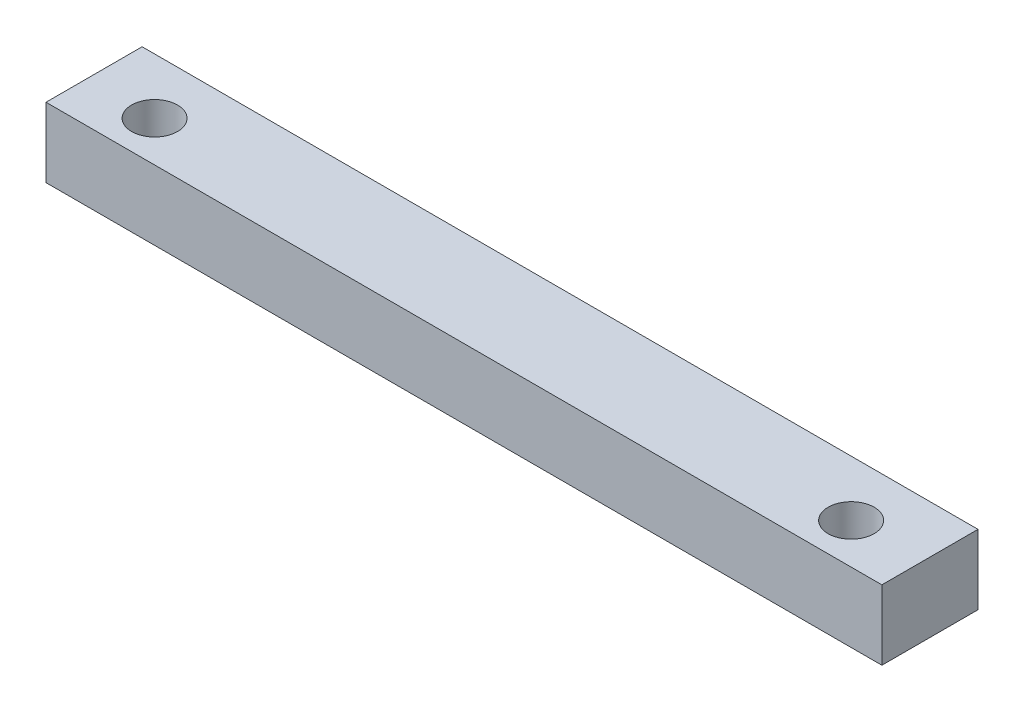
ISO-10303-21;
HEADER;
FILE_DESCRIPTION(('STEP AP214'),'2;1');
FILE_NAME('part.step','',(''),(''),'','','');
FILE_SCHEMA(('AUTOMOTIVE_DESIGN { 1 0 10303 214 1 1 1 1 }'));
ENDSEC;
DATA;
#1=APPLICATION_CONTEXT('core data for automotive mechanical design processes');
#2=APPLICATION_PROTOCOL_DEFINITION('international standard','automotive_design',2000,#1);
#3=PRODUCT_CONTEXT('',#1,'mechanical');
#4=PRODUCT('Part','Part','',(#3));
#5=PRODUCT_RELATED_PRODUCT_CATEGORY('part','',(#4));
#6=PRODUCT_DEFINITION_FORMATION('','',#4);
#7=PRODUCT_DEFINITION_CONTEXT('part definition',#1,'design');
#8=PRODUCT_DEFINITION('design','',#6,#7);
#9=PRODUCT_DEFINITION_SHAPE('','',#8);
#10=(LENGTH_UNIT() NAMED_UNIT(*) SI_UNIT(.MILLI.,.METRE.));
#11=(NAMED_UNIT(*) PLANE_ANGLE_UNIT() SI_UNIT($,.RADIAN.));
#12=(NAMED_UNIT(*) SI_UNIT($,.STERADIAN.) SOLID_ANGLE_UNIT());
#13=UNCERTAINTY_MEASURE_WITH_UNIT(LENGTH_MEASURE(1.E-05),#10,'distance_accuracy_value','');
#14=(GEOMETRIC_REPRESENTATION_CONTEXT(3) GLOBAL_UNCERTAINTY_ASSIGNED_CONTEXT((#13)) GLOBAL_UNIT_ASSIGNED_CONTEXT((#10,
#11,#12)) REPRESENTATION_CONTEXT('',''));
#15=CARTESIAN_POINT('',(0.,0.,0.));
#16=DIRECTION('',(0.,0.,1.));
#17=DIRECTION('',(1.,0.,0.));
#18=AXIS2_PLACEMENT_3D('',#15,#16,#17);
#19=CARTESIAN_POINT('',(-42.9708845876065,5.,-4.52794899372876));
#20=DIRECTION('',(1.,0.,0.));
#21=DIRECTION('',(0.,0.,-1.));
#22=AXIS2_PLACEMENT_3D('',#19,#20,#21);
#23=PLANE('',#22);
#24=DIRECTION('',(0.,0.,1.));
#25=VECTOR('',#24,1.);
#26=CARTESIAN_POINT('',(-42.9708845876065,0.,-4.52794899372876));
#27=LINE('',#26,#25);
#28=CARTESIAN_POINT('',(-42.9708845876065,0.,-4.52794899372876));
#29=VERTEX_POINT('',#28);
#30=CARTESIAN_POINT('',(-42.9708845876065,0.,2.37205100627124));
#31=VERTEX_POINT('',#30);
#32=EDGE_CURVE('E111',#29,#31,#27,.T.);
#33=ORIENTED_EDGE('',*,*,#32,.T.);
#34=DIRECTION('',(0.,-1.,0.));
#35=VECTOR('',#34,1.);
#36=CARTESIAN_POINT('',(-42.9708845876065,5.,2.37205100627124));
#37=LINE('',#36,#35);
#38=CARTESIAN_POINT('',(-42.9708845876065,5.,2.37205100627124));
#39=VERTEX_POINT('',#38);
#40=EDGE_CURVE('E11',#39,#31,#37,.T.);
#41=ORIENTED_EDGE('',*,*,#40,.F.);
#42=DIRECTION('',(0.,0.,1.));
#43=VECTOR('',#42,1.);
#44=CARTESIAN_POINT('',(-42.9708845876065,5.,-4.52794899372876));
#45=LINE('',#44,#43);
#46=CARTESIAN_POINT('',(-42.9708845876065,5.,-4.52794899372876));
#47=VERTEX_POINT('',#46);
#48=EDGE_CURVE('E95',#47,#39,#45,.T.);
#49=ORIENTED_EDGE('',*,*,#48,.F.);
#50=DIRECTION('',(0.,-1.,0.));
#51=VECTOR('',#50,1.);
#52=CARTESIAN_POINT('',(-42.9708845876065,5.,-4.52794899372876));
#53=LINE('',#52,#51);
#54=EDGE_CURVE('E107',#47,#29,#53,.T.);
#55=ORIENTED_EDGE('',*,*,#54,.T.);
#56=EDGE_LOOP('',(#33,#41,#49,#55));
#57=FACE_BOUND('',#56,.T.);
#58=ADVANCED_FACE('F43',(#57),#23,.F.);
#59=CARTESIAN_POINT('',(-42.9708845876065,5.,2.37205100627124));
#60=DIRECTION('',(0.,0.,-1.));
#61=DIRECTION('',(-1.,0.,0.));
#62=AXIS2_PLACEMENT_3D('',#59,#60,#61);
#63=PLANE('',#62);
#64=DIRECTION('',(1.,0.,0.));
#65=VECTOR('',#64,1.);
#66=CARTESIAN_POINT('',(-42.9708845876065,0.,2.37205100627124));
#67=LINE('',#66,#65);
#68=CARTESIAN_POINT('',(17.0291154123935,0.,2.37205100627124));
#69=VERTEX_POINT('',#68);
#70=EDGE_CURVE('E100',#31,#69,#67,.T.);
#71=ORIENTED_EDGE('',*,*,#70,.T.);
#72=DIRECTION('',(0.,-1.,0.));
#73=VECTOR('',#72,1.);
#74=CARTESIAN_POINT('',(17.0291154123935,5.,2.37205100627124));
#75=LINE('',#74,#73);
#76=CARTESIAN_POINT('',(17.0291154123935,5.,2.37205100627124));
#77=VERTEX_POINT('',#76);
#78=EDGE_CURVE('E52',#77,#69,#75,.T.);
#79=ORIENTED_EDGE('',*,*,#78,.F.);
#80=DIRECTION('',(1.,0.,0.));
#81=VECTOR('',#80,1.);
#82=CARTESIAN_POINT('',(-42.9708845876065,5.,2.37205100627124));
#83=LINE('',#82,#81);
#84=EDGE_CURVE('E90',#39,#77,#83,.T.);
#85=ORIENTED_EDGE('',*,*,#84,.F.);
#86=ORIENTED_EDGE('',*,*,#40,.T.);
#87=EDGE_LOOP('',(#71,#79,#85,#86));
#88=FACE_BOUND('',#87,.T.);
#89=ADVANCED_FACE('F99',(#88),#63,.F.);
#90=CARTESIAN_POINT('',(17.0291154123935,5.,-4.52794899372876));
#91=DIRECTION('',(-1.,0.,0.));
#92=DIRECTION('',(0.,0.,1.));
#93=AXIS2_PLACEMENT_3D('',#90,#91,#92);
#94=PLANE('',#93);
#95=DIRECTION('',(0.,0.,-1.));
#96=VECTOR('',#95,1.);
#97=CARTESIAN_POINT('',(17.0291154123935,0.,-4.52794899372876));
#98=LINE('',#97,#96);
#99=CARTESIAN_POINT('',(17.0291154123935,0.,-4.52794899372876));
#100=VERTEX_POINT('',#99);
#101=EDGE_CURVE('E77',#69,#100,#98,.T.);
#102=ORIENTED_EDGE('',*,*,#101,.T.);
#103=DIRECTION('',(0.,-1.,0.));
#104=VECTOR('',#103,1.);
#105=CARTESIAN_POINT('',(17.0291154123935,5.,-4.52794899372876));
#106=LINE('',#105,#104);
#107=CARTESIAN_POINT('',(17.0291154123935,5.,-4.52794899372876));
#108=VERTEX_POINT('',#107);
#109=EDGE_CURVE('E102',#108,#100,#106,.T.);
#110=ORIENTED_EDGE('',*,*,#109,.F.);
#111=DIRECTION('',(0.,0.,-1.));
#112=VECTOR('',#111,1.);
#113=CARTESIAN_POINT('',(17.0291154123935,5.,-4.52794899372876));
#114=LINE('',#113,#112);
#115=EDGE_CURVE('E93',#77,#108,#114,.T.);
#116=ORIENTED_EDGE('',*,*,#115,.F.);
#117=ORIENTED_EDGE('',*,*,#78,.T.);
#118=EDGE_LOOP('',(#102,#110,#116,#117));
#119=FACE_BOUND('',#118,.T.);
#120=ADVANCED_FACE('F103',(#119),#94,.F.);
#121=CARTESIAN_POINT('',(-42.9708845876065,5.,-4.52794899372876));
#122=DIRECTION('',(0.,0.,1.));
#123=DIRECTION('',(1.,0.,0.));
#124=AXIS2_PLACEMENT_3D('',#121,#122,#123);
#125=PLANE('',#124);
#126=DIRECTION('',(-1.,0.,0.));
#127=VECTOR('',#126,1.);
#128=CARTESIAN_POINT('',(-42.9708845876065,0.,-4.52794899372876));
#129=LINE('',#128,#127);
#130=EDGE_CURVE('E83',#100,#29,#129,.T.);
#131=ORIENTED_EDGE('',*,*,#130,.T.);
#132=ORIENTED_EDGE('',*,*,#54,.F.);
#133=DIRECTION('',(-1.,0.,0.));
#134=VECTOR('',#133,1.);
#135=CARTESIAN_POINT('',(-42.9708845876065,5.,-4.52794899372876));
#136=LINE('',#135,#134);
#137=EDGE_CURVE('E60',#108,#47,#136,.T.);
#138=ORIENTED_EDGE('',*,*,#137,.F.);
#139=ORIENTED_EDGE('',*,*,#109,.T.);
#140=EDGE_LOOP('',(#131,#132,#138,#139));
#141=FACE_BOUND('',#140,.T.);
#142=ADVANCED_FACE('F125',(#141),#125,.F.);
#143=CARTESIAN_POINT('',(0.,5.,0.));
#144=DIRECTION('',(0.,1.,0.));
#145=DIRECTION('',(0.,0.,1.));
#146=AXIS2_PLACEMENT_3D('',#143,#144,#145);
#147=PLANE('',#146);
#148=CARTESIAN_POINT('',(11.9231033626032,5.,-0.527948993728763));
#149=DIRECTION('',(0.,1.,0.));
#150=DIRECTION('',(0.,0.,1.));
#151=AXIS2_PLACEMENT_3D('',#148,#149,#150);
#152=CIRCLE('',#151,1.65);
#153=CARTESIAN_POINT('',(11.9231033626032,5.,1.12205100627124));
#154=VERTEX_POINT('',#153);
#155=EDGE_CURVE('E115',#154,#154,#152,.T.);
#156=ORIENTED_EDGE('',*,*,#155,.F.);
#157=EDGE_LOOP('',(#156));
#158=FACE_BOUND('',#157,.T.);
#159=CARTESIAN_POINT('',(-38.0768966373968,5.,-0.527948993728763));
#160=DIRECTION('',(0.,1.,0.));
#161=DIRECTION('',(0.,0.,1.));
#162=AXIS2_PLACEMENT_3D('',#159,#160,#161);
#163=CIRCLE('',#162,1.65);
#164=CARTESIAN_POINT('',(-38.0768966373968,5.,1.12205100627124));
#165=VERTEX_POINT('',#164);
#166=EDGE_CURVE('E135',#165,#165,#163,.T.);
#167=ORIENTED_EDGE('',*,*,#166,.F.);
#168=EDGE_LOOP('',(#167));
#169=FACE_BOUND('',#168,.T.);
#170=ORIENTED_EDGE('',*,*,#48,.T.);
#171=ORIENTED_EDGE('',*,*,#84,.T.);
#172=ORIENTED_EDGE('',*,*,#115,.T.);
#173=ORIENTED_EDGE('',*,*,#137,.T.);
#174=EDGE_LOOP('',(#170,#171,#172,#173));
#175=FACE_BOUND('',#174,.T.);
#176=ADVANCED_FACE('F91',(#158,#169,#175),#147,.T.);
#177=CARTESIAN_POINT('',(0.,0.,0.));
#178=DIRECTION('',(0.,1.,0.));
#179=DIRECTION('',(0.,0.,1.));
#180=AXIS2_PLACEMENT_3D('',#177,#178,#179);
#181=PLANE('',#180);
#182=CARTESIAN_POINT('',(11.9231033626032,0.,-0.527948993728763));
#183=DIRECTION('',(0.,-1.,0.));
#184=DIRECTION('',(0.,0.,-1.));
#185=AXIS2_PLACEMENT_3D('',#182,#183,#184);
#186=CIRCLE('',#185,1.65);
#187=CARTESIAN_POINT('',(11.9231033626032,0.,-2.17794899372876));
#188=VERTEX_POINT('',#187);
#189=EDGE_CURVE('E139',#188,#188,#186,.T.);
#190=ORIENTED_EDGE('',*,*,#189,.F.);
#191=EDGE_LOOP('',(#190));
#192=FACE_BOUND('',#191,.T.);
#193=CARTESIAN_POINT('',(-38.0768966373968,0.,-0.527948993728763));
#194=DIRECTION('',(0.,-1.,0.));
#195=DIRECTION('',(0.,0.,-1.));
#196=AXIS2_PLACEMENT_3D('',#193,#194,#195);
#197=CIRCLE('',#196,1.65);
#198=CARTESIAN_POINT('',(-38.0768966373968,0.,-2.17794899372876));
#199=VERTEX_POINT('',#198);
#200=EDGE_CURVE('E140',#199,#199,#197,.T.);
#201=ORIENTED_EDGE('',*,*,#200,.F.);
#202=EDGE_LOOP('',(#201));
#203=FACE_BOUND('',#202,.T.);
#204=ORIENTED_EDGE('',*,*,#32,.F.);
#205=ORIENTED_EDGE('',*,*,#130,.F.);
#206=ORIENTED_EDGE('',*,*,#101,.F.);
#207=ORIENTED_EDGE('',*,*,#70,.F.);
#208=EDGE_LOOP('',(#204,#205,#206,#207));
#209=FACE_BOUND('',#208,.T.);
#210=ADVANCED_FACE('F128',(#192,#203,#209),#181,.F.);
#211=CARTESIAN_POINT('',(-38.0768966373968,10.,-0.527948993728763));
#212=DIRECTION('',(0.,-1.,0.));
#213=DIRECTION('',(0.,0.,-1.));
#214=AXIS2_PLACEMENT_3D('',#211,#212,#213);
#215=CYLINDRICAL_SURFACE('',#214,1.65);
#216=ORIENTED_EDGE('',*,*,#166,.T.);
#217=EDGE_LOOP('',(#216));
#218=FACE_BOUND('',#217,.T.);
#219=ORIENTED_EDGE('',*,*,#200,.T.);
#220=EDGE_LOOP('',(#219));
#221=FACE_BOUND('',#220,.T.);
#222=ADVANCED_FACE('F152',(#218,#221),#215,.F.);
#223=CARTESIAN_POINT('',(11.9231033626032,10.,-0.527948993728763));
#224=DIRECTION('',(0.,-1.,0.));
#225=DIRECTION('',(0.,0.,-1.));
#226=AXIS2_PLACEMENT_3D('',#223,#224,#225);
#227=CYLINDRICAL_SURFACE('',#226,1.65);
#228=ORIENTED_EDGE('',*,*,#155,.T.);
#229=EDGE_LOOP('',(#228));
#230=FACE_BOUND('',#229,.T.);
#231=ORIENTED_EDGE('',*,*,#189,.T.);
#232=EDGE_LOOP('',(#231));
#233=FACE_BOUND('',#232,.T.);
#234=ADVANCED_FACE('F148',(#230,#233),#227,.F.);
#235=CLOSED_SHELL('',(#58,#89,#120,#142,#176,#210,#222,#234));
#236=MANIFOLD_SOLID_BREP('B2',#235);
#237=ADVANCED_BREP_SHAPE_REPRESENTATION('',(#18,#236),#14);
#238=SHAPE_DEFINITION_REPRESENTATION(#9,#237);
ENDSEC;
END-ISO-10303-21;
